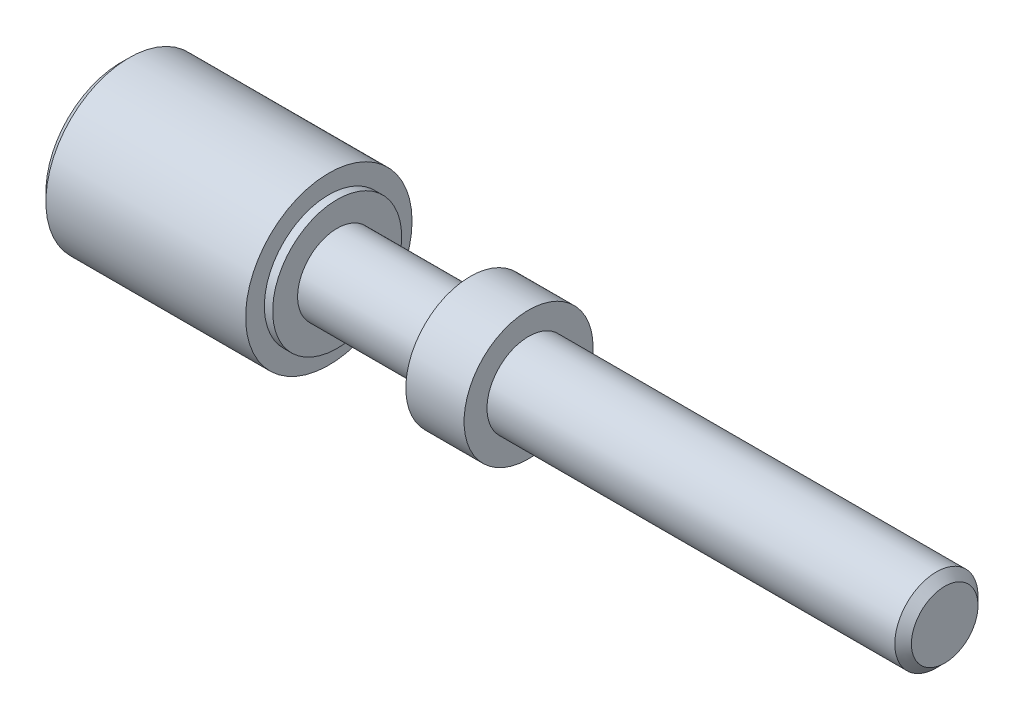
ISO-10303-21;
HEADER;
FILE_DESCRIPTION(('STEP AP214'),'2;1');
FILE_NAME('part.step','',(''),(''),'','','');
FILE_SCHEMA(('AUTOMOTIVE_DESIGN { 1 0 10303 214 1 1 1 1 }'));
ENDSEC;
DATA;
#1=APPLICATION_CONTEXT('core data for automotive mechanical design processes');
#2=APPLICATION_PROTOCOL_DEFINITION('international standard','automotive_design',2000,#1);
#3=PRODUCT_CONTEXT('',#1,'mechanical');
#4=PRODUCT('Part','Part','',(#3));
#5=PRODUCT_RELATED_PRODUCT_CATEGORY('part','',(#4));
#6=PRODUCT_DEFINITION_FORMATION('','',#4);
#7=PRODUCT_DEFINITION_CONTEXT('part definition',#1,'design');
#8=PRODUCT_DEFINITION('design','',#6,#7);
#9=PRODUCT_DEFINITION_SHAPE('','',#8);
#10=(LENGTH_UNIT() NAMED_UNIT(*) SI_UNIT(.MILLI.,.METRE.));
#11=(NAMED_UNIT(*) PLANE_ANGLE_UNIT() SI_UNIT($,.RADIAN.));
#12=(NAMED_UNIT(*) SI_UNIT($,.STERADIAN.) SOLID_ANGLE_UNIT());
#13=UNCERTAINTY_MEASURE_WITH_UNIT(LENGTH_MEASURE(1.E-05),#10,'distance_accuracy_value','');
#14=(GEOMETRIC_REPRESENTATION_CONTEXT(3) GLOBAL_UNCERTAINTY_ASSIGNED_CONTEXT((#13)) GLOBAL_UNIT_ASSIGNED_CONTEXT((#10,
#11,#12)) REPRESENTATION_CONTEXT('',''));
#15=CARTESIAN_POINT('',(0.,0.,0.));
#16=DIRECTION('',(0.,0.,1.));
#17=DIRECTION('',(1.,0.,0.));
#18=AXIS2_PLACEMENT_3D('',#15,#16,#17);
#19=CARTESIAN_POINT('',(-13.0000000000337,0.,0.));
#20=DIRECTION('',(-1.,0.,0.));
#21=DIRECTION('',(0.,0.,1.));
#22=AXIS2_PLACEMENT_3D('',#19,#20,#21);
#23=CONICAL_SURFACE('',#22,5.0000000000523,1.04719755120017);
#24=CARTESIAN_POINT('',(-13.0000000000337,0.,0.));
#25=DIRECTION('',(-1.,0.,0.));
#26=DIRECTION('',(0.,0.,1.));
#27=AXIS2_PLACEMENT_3D('',#24,#25,#26);
#28=CIRCLE('',#27,5.0000000000523);
#29=CARTESIAN_POINT('',(-13.0000000000168,4.33012701894484,2.50000000001307));
#30=VERTEX_POINT('',#29);
#31=CARTESIAN_POINT('',(-13.0000000000168,4.33012701894484,-2.50000000001308));
#32=VERTEX_POINT('',#31);
#33=EDGE_CURVE('E107',#30,#32,#28,.T.);
#34=ORIENTED_EDGE('',*,*,#33,.T.);
#35=CARTESIAN_POINT('',(-13.0000000000337,0.,0.));
#36=DIRECTION('',(-1.,0.,0.));
#37=DIRECTION('',(0.,0.,1.));
#38=AXIS2_PLACEMENT_3D('',#35,#36,#37);
#39=CIRCLE('',#38,5.0000000000523);
#40=CARTESIAN_POINT('',(-13.0000000000168,0.,-5.00000000002615));
#41=VERTEX_POINT('',#40);
#42=EDGE_CURVE('E115',#32,#41,#39,.T.);
#43=ORIENTED_EDGE('',*,*,#42,.T.);
#44=CARTESIAN_POINT('',(-13.0000000000337,0.,0.));
#45=DIRECTION('',(-1.,0.,0.));
#46=DIRECTION('',(0.,0.,1.));
#47=AXIS2_PLACEMENT_3D('',#44,#45,#46);
#48=CIRCLE('',#47,5.0000000000523);
#49=CARTESIAN_POINT('',(-13.0000000000168,-4.33012701894484,-2.50000000001308));
#50=VERTEX_POINT('',#49);
#51=EDGE_CURVE('E217',#41,#50,#48,.T.);
#52=ORIENTED_EDGE('',*,*,#51,.T.);
#53=CARTESIAN_POINT('',(-13.0000000000337,0.,0.));
#54=DIRECTION('',(-1.,0.,0.));
#55=DIRECTION('',(0.,0.,1.));
#56=AXIS2_PLACEMENT_3D('',#53,#54,#55);
#57=CIRCLE('',#56,5.0000000000523);
#58=CARTESIAN_POINT('',(-13.0000000000168,-4.33012701894484,2.50000000001308));
#59=VERTEX_POINT('',#58);
#60=EDGE_CURVE('E89',#50,#59,#57,.T.);
#61=ORIENTED_EDGE('',*,*,#60,.T.);
#62=CARTESIAN_POINT('',(-13.0000000000337,0.,0.));
#63=DIRECTION('',(-1.,0.,0.));
#64=DIRECTION('',(0.,0.,1.));
#65=AXIS2_PLACEMENT_3D('',#62,#63,#64);
#66=CIRCLE('',#65,5.0000000000523);
#67=CARTESIAN_POINT('',(-13.0000000000168,0.,5.00000000002615));
#68=VERTEX_POINT('',#67);
#69=EDGE_CURVE('E20',#59,#68,#66,.T.);
#70=ORIENTED_EDGE('',*,*,#69,.T.);
#71=CARTESIAN_POINT('',(-13.0000000000337,0.,0.));
#72=DIRECTION('',(-1.,0.,0.));
#73=DIRECTION('',(0.,0.,1.));
#74=AXIS2_PLACEMENT_3D('',#71,#72,#73);
#75=CIRCLE('',#74,5.0000000000523);
#76=EDGE_CURVE('E95',#68,#30,#75,.T.);
#77=ORIENTED_EDGE('',*,*,#76,.T.);
#78=EDGE_LOOP('',(#34,#43,#52,#61,#70,#77));
#79=FACE_BOUND('',#78,.T.);
#80=CARTESIAN_POINT('',(-10.1132486540507,2.8421709430404E-11,0.));
#81=VERTEX_POINT('',#80);
#82=VERTEX_LOOP('',#81);
#83=FACE_BOUND('',#82,.T.);
#84=ADVANCED_FACE('F17',(#79,#83),#23,.F.);
#85=CARTESIAN_POINT('',(-13.,0.,0.));
#86=DIRECTION('',(1.,0.,0.));
#87=DIRECTION('',(0.,0.,-1.));
#88=AXIS2_PLACEMENT_3D('',#85,#86,#87);
#89=PLANE('',#88);
#90=DIRECTION('',(0.,-0.5,-0.866025403784439));
#91=VECTOR('',#90,1.);
#92=CARTESIAN_POINT('',(-13.,-5.77350269189626,0.));
#93=LINE('',#92,#91);
#94=CARTESIAN_POINT('',(-13.,-2.88675134594813,5.));
#95=VERTEX_POINT('',#94);
#96=EDGE_CURVE('E102',#59,#95,#93,.F.);
#97=ORIENTED_EDGE('',*,*,#96,.T.);
#98=DIRECTION('',(0.,1.,0.));
#99=VECTOR('',#98,1.);
#100=CARTESIAN_POINT('',(-13.,-2.88675134594813,5.));
#101=LINE('',#100,#99);
#102=EDGE_CURVE('E100',#95,#68,#101,.T.);
#103=ORIENTED_EDGE('',*,*,#102,.T.);
#104=ORIENTED_EDGE('',*,*,#69,.F.);
#105=EDGE_LOOP('',(#97,#103,#104));
#106=FACE_BOUND('',#105,.T.);
#107=ADVANCED_FACE('F101',(#106),#89,.F.);
#108=CARTESIAN_POINT('',(-13.,0.,0.));
#109=DIRECTION('',(1.,0.,0.));
#110=DIRECTION('',(0.,0.,-1.));
#111=AXIS2_PLACEMENT_3D('',#108,#109,#110);
#112=PLANE('',#111);
#113=DIRECTION('',(0.,0.5,-0.866025403784439));
#114=VECTOR('',#113,1.);
#115=CARTESIAN_POINT('',(-13.,-2.88675134594813,-5.));
#116=LINE('',#115,#114);
#117=CARTESIAN_POINT('',(-13.,-5.77350269189626,0.));
#118=VERTEX_POINT('',#117);
#119=EDGE_CURVE('E165',#50,#118,#116,.F.);
#120=ORIENTED_EDGE('',*,*,#119,.T.);
#121=DIRECTION('',(0.,-0.5,-0.866025403784439));
#122=VECTOR('',#121,1.);
#123=CARTESIAN_POINT('',(-13.,-5.77350269189626,0.));
#124=LINE('',#123,#122);
#125=EDGE_CURVE('E120',#118,#59,#124,.F.);
#126=ORIENTED_EDGE('',*,*,#125,.T.);
#127=ORIENTED_EDGE('',*,*,#60,.F.);
#128=EDGE_LOOP('',(#120,#126,#127));
#129=FACE_BOUND('',#128,.T.);
#130=ADVANCED_FACE('F228',(#129),#112,.F.);
#131=CARTESIAN_POINT('',(-13.,0.,0.));
#132=DIRECTION('',(1.,0.,0.));
#133=DIRECTION('',(0.,0.,-1.));
#134=AXIS2_PLACEMENT_3D('',#131,#132,#133);
#135=PLANE('',#134);
#136=DIRECTION('',(0.,1.,0.));
#137=VECTOR('',#136,1.);
#138=CARTESIAN_POINT('',(-13.,2.88675134594813,-5.));
#139=LINE('',#138,#137);
#140=CARTESIAN_POINT('',(-13.,-2.88675134594813,-5.));
#141=VERTEX_POINT('',#140);
#142=EDGE_CURVE('E151',#41,#141,#139,.F.);
#143=ORIENTED_EDGE('',*,*,#142,.T.);
#144=DIRECTION('',(0.,0.5,-0.866025403784439));
#145=VECTOR('',#144,1.);
#146=CARTESIAN_POINT('',(-13.,-2.88675134594813,-5.));
#147=LINE('',#146,#145);
#148=EDGE_CURVE('E162',#141,#50,#147,.F.);
#149=ORIENTED_EDGE('',*,*,#148,.T.);
#150=ORIENTED_EDGE('',*,*,#51,.F.);
#151=EDGE_LOOP('',(#143,#149,#150));
#152=FACE_BOUND('',#151,.T.);
#153=ADVANCED_FACE('F223',(#152),#135,.F.);
#154=CARTESIAN_POINT('',(-13.,0.,0.));
#155=DIRECTION('',(1.,0.,0.));
#156=DIRECTION('',(0.,0.,-1.));
#157=AXIS2_PLACEMENT_3D('',#154,#155,#156);
#158=PLANE('',#157);
#159=DIRECTION('',(0.,0.5,0.866025403784439));
#160=VECTOR('',#159,1.);
#161=CARTESIAN_POINT('',(-13.,5.77350269189626,0.));
#162=LINE('',#161,#160);
#163=CARTESIAN_POINT('',(-13.,2.88675134594813,-5.));
#164=VERTEX_POINT('',#163);
#165=EDGE_CURVE('E142',#32,#164,#162,.F.);
#166=ORIENTED_EDGE('',*,*,#165,.T.);
#167=DIRECTION('',(0.,1.,0.));
#168=VECTOR('',#167,1.);
#169=CARTESIAN_POINT('',(-13.,2.88675134594813,-5.));
#170=LINE('',#169,#168);
#171=EDGE_CURVE('E148',#164,#41,#170,.F.);
#172=ORIENTED_EDGE('',*,*,#171,.T.);
#173=ORIENTED_EDGE('',*,*,#42,.F.);
#174=EDGE_LOOP('',(#166,#172,#173));
#175=FACE_BOUND('',#174,.T.);
#176=ADVANCED_FACE('F273',(#175),#158,.F.);
#177=CARTESIAN_POINT('',(-13.,0.,0.));
#178=DIRECTION('',(1.,0.,0.));
#179=DIRECTION('',(0.,0.,-1.));
#180=AXIS2_PLACEMENT_3D('',#177,#178,#179);
#181=PLANE('',#180);
#182=DIRECTION('',(0.,1.,0.));
#183=VECTOR('',#182,1.);
#184=CARTESIAN_POINT('',(-13.,-2.88675134594813,5.));
#185=LINE('',#184,#183);
#186=CARTESIAN_POINT('',(-13.,2.88675134594813,5.));
#187=VERTEX_POINT('',#186);
#188=EDGE_CURVE('E106',#68,#187,#185,.T.);
#189=ORIENTED_EDGE('',*,*,#188,.T.);
#190=DIRECTION('',(0.,-0.5,0.866025403784439));
#191=VECTOR('',#190,1.);
#192=CARTESIAN_POINT('',(-13.,2.88675134594813,5.));
#193=LINE('',#192,#191);
#194=EDGE_CURVE('E113',#187,#30,#193,.F.);
#195=ORIENTED_EDGE('',*,*,#194,.T.);
#196=ORIENTED_EDGE('',*,*,#76,.F.);
#197=EDGE_LOOP('',(#189,#195,#196));
#198=FACE_BOUND('',#197,.T.);
#199=ADVANCED_FACE('F110',(#198),#181,.F.);
#200=CARTESIAN_POINT('',(-13.,0.,0.));
#201=DIRECTION('',(1.,0.,0.));
#202=DIRECTION('',(0.,0.,-1.));
#203=AXIS2_PLACEMENT_3D('',#200,#201,#202);
#204=PLANE('',#203);
#205=DIRECTION('',(0.,-0.5,0.866025403784439));
#206=VECTOR('',#205,1.);
#207=CARTESIAN_POINT('',(-13.,2.88675134594813,5.));
#208=LINE('',#207,#206);
#209=CARTESIAN_POINT('',(-13.,5.77350269189626,0.));
#210=VERTEX_POINT('',#209);
#211=EDGE_CURVE('E257',#30,#210,#208,.F.);
#212=ORIENTED_EDGE('',*,*,#211,.T.);
#213=DIRECTION('',(0.,0.5,0.866025403784439));
#214=VECTOR('',#213,1.);
#215=CARTESIAN_POINT('',(-13.,5.77350269189626,0.));
#216=LINE('',#215,#214);
#217=EDGE_CURVE('E145',#210,#32,#216,.F.);
#218=ORIENTED_EDGE('',*,*,#217,.T.);
#219=ORIENTED_EDGE('',*,*,#33,.F.);
#220=EDGE_LOOP('',(#212,#218,#219));
#221=FACE_BOUND('',#220,.T.);
#222=ADVANCED_FACE('F270',(#221),#204,.F.);
#223=CARTESIAN_POINT('',(-25.,-2.88675134594813,5.));
#224=DIRECTION('',(0.,0.,1.));
#225=DIRECTION('',(1.,0.,0.));
#226=AXIS2_PLACEMENT_3D('',#223,#224,#225);
#227=PLANE('',#226);
#228=DIRECTION('',(1.,0.,0.));
#229=VECTOR('',#228,1.);
#230=CARTESIAN_POINT('',(-25.,2.88675134594813,5.));
#231=LINE('',#230,#229);
#232=CARTESIAN_POINT('',(-25.,2.88675134594813,5.));
#233=VERTEX_POINT('',#232);
#234=EDGE_CURVE('E119',#233,#187,#231,.T.);
#235=ORIENTED_EDGE('',*,*,#234,.T.);
#236=ORIENTED_EDGE('',*,*,#188,.F.);
#237=ORIENTED_EDGE('',*,*,#102,.F.);
#238=DIRECTION('',(1.,0.,0.));
#239=VECTOR('',#238,1.);
#240=CARTESIAN_POINT('',(-25.,-2.88675134594813,5.));
#241=LINE('',#240,#239);
#242=CARTESIAN_POINT('',(-25.,-2.88675134594813,5.));
#243=VERTEX_POINT('',#242);
#244=EDGE_CURVE('E166',#95,#243,#241,.F.);
#245=ORIENTED_EDGE('',*,*,#244,.T.);
#246=DIRECTION('',(0.,1.,0.));
#247=VECTOR('',#246,1.);
#248=CARTESIAN_POINT('',(-25.,4.5,5.));
#249=LINE('',#248,#247);
#250=EDGE_CURVE('E129',#233,#243,#249,.F.);
#251=ORIENTED_EDGE('',*,*,#250,.F.);
#252=EDGE_LOOP('',(#235,#236,#237,#245,#251));
#253=FACE_BOUND('',#252,.T.);
#254=ADVANCED_FACE('F117',(#253),#227,.F.);
#255=CARTESIAN_POINT('',(-25.,-5.77350269189626,0.));
#256=DIRECTION('',(0.,-0.866025403784439,0.5));
#257=DIRECTION('',(0.,-0.5,-0.866025403784439));
#258=AXIS2_PLACEMENT_3D('',#255,#256,#257);
#259=PLANE('',#258);
#260=ORIENTED_EDGE('',*,*,#244,.F.);
#261=ORIENTED_EDGE('',*,*,#96,.F.);
#262=ORIENTED_EDGE('',*,*,#125,.F.);
#263=DIRECTION('',(1.,0.,0.));
#264=VECTOR('',#263,1.);
#265=CARTESIAN_POINT('',(-25.,-5.77350269189626,0.));
#266=LINE('',#265,#264);
#267=CARTESIAN_POINT('',(-25.,-5.77350269189626,0.));
#268=VERTEX_POINT('',#267);
#269=EDGE_CURVE('E152',#118,#268,#266,.F.);
#270=ORIENTED_EDGE('',*,*,#269,.T.);
#271=DIRECTION('',(0.,-0.5,-0.866025403784439));
#272=VECTOR('',#271,1.);
#273=CARTESIAN_POINT('',(-25.,-2.88675134594813,5.));
#274=LINE('',#273,#272);
#275=EDGE_CURVE('E132',#243,#268,#274,.T.);
#276=ORIENTED_EDGE('',*,*,#275,.F.);
#277=EDGE_LOOP('',(#260,#261,#262,#270,#276));
#278=FACE_BOUND('',#277,.T.);
#279=ADVANCED_FACE('F238',(#278),#259,.F.);
#280=CARTESIAN_POINT('',(-25.,-2.88675134594813,-5.));
#281=DIRECTION('',(0.,-0.866025403784439,-0.5));
#282=DIRECTION('',(0.,0.5,-0.866025403784439));
#283=AXIS2_PLACEMENT_3D('',#280,#281,#282);
#284=PLANE('',#283);
#285=ORIENTED_EDGE('',*,*,#269,.F.);
#286=ORIENTED_EDGE('',*,*,#119,.F.);
#287=ORIENTED_EDGE('',*,*,#148,.F.);
#288=DIRECTION('',(-1.,0.,0.));
#289=VECTOR('',#288,1.);
#290=CARTESIAN_POINT('',(-25.,-2.88675134594813,-5.));
#291=LINE('',#290,#289);
#292=CARTESIAN_POINT('',(-25.,-2.88675134594813,-5.));
#293=VERTEX_POINT('',#292);
#294=EDGE_CURVE('E159',#141,#293,#291,.T.);
#295=ORIENTED_EDGE('',*,*,#294,.T.);
#296=DIRECTION('',(0.,0.5,-0.866025403784439));
#297=VECTOR('',#296,1.);
#298=CARTESIAN_POINT('',(-25.,-5.77350269189626,0.));
#299=LINE('',#298,#297);
#300=EDGE_CURVE('E234',#268,#293,#299,.T.);
#301=ORIENTED_EDGE('',*,*,#300,.F.);
#302=EDGE_LOOP('',(#285,#286,#287,#295,#301));
#303=FACE_BOUND('',#302,.T.);
#304=ADVANCED_FACE('F231',(#303),#284,.F.);
#305=CARTESIAN_POINT('',(-25.,2.88675134594813,-5.));
#306=DIRECTION('',(0.,0.,-1.));
#307=DIRECTION('',(-1.,0.,0.));
#308=AXIS2_PLACEMENT_3D('',#305,#306,#307);
#309=PLANE('',#308);
#310=ORIENTED_EDGE('',*,*,#294,.F.);
#311=ORIENTED_EDGE('',*,*,#142,.F.);
#312=ORIENTED_EDGE('',*,*,#171,.F.);
#313=DIRECTION('',(1.,0.,0.));
#314=VECTOR('',#313,1.);
#315=CARTESIAN_POINT('',(-25.,2.88675134594813,-5.));
#316=LINE('',#315,#314);
#317=CARTESIAN_POINT('',(-25.,2.88675134594813,-5.));
#318=VERTEX_POINT('',#317);
#319=EDGE_CURVE('E144',#164,#318,#316,.F.);
#320=ORIENTED_EDGE('',*,*,#319,.T.);
#321=DIRECTION('',(0.,1.,0.));
#322=VECTOR('',#321,1.);
#323=CARTESIAN_POINT('',(-25.,4.5,-5.));
#324=LINE('',#323,#322);
#325=EDGE_CURVE('E247',#293,#318,#324,.T.);
#326=ORIENTED_EDGE('',*,*,#325,.F.);
#327=EDGE_LOOP('',(#310,#311,#312,#320,#326));
#328=FACE_BOUND('',#327,.T.);
#329=ADVANCED_FACE('F277',(#328),#309,.F.);
#330=CARTESIAN_POINT('',(-25.,5.77350269189626,0.));
#331=DIRECTION('',(0.,0.866025403784439,-0.5));
#332=DIRECTION('',(0.,0.5,0.866025403784439));
#333=AXIS2_PLACEMENT_3D('',#330,#331,#332);
#334=PLANE('',#333);
#335=ORIENTED_EDGE('',*,*,#319,.F.);
#336=ORIENTED_EDGE('',*,*,#165,.F.);
#337=ORIENTED_EDGE('',*,*,#217,.F.);
#338=DIRECTION('',(1.,0.,0.));
#339=VECTOR('',#338,1.);
#340=CARTESIAN_POINT('',(-25.,5.77350269189626,0.));
#341=LINE('',#340,#339);
#342=CARTESIAN_POINT('',(-25.,5.77350269189626,0.));
#343=VERTEX_POINT('',#342);
#344=EDGE_CURVE('E35',#210,#343,#341,.F.);
#345=ORIENTED_EDGE('',*,*,#344,.T.);
#346=DIRECTION('',(0.,0.5,0.866025403784439));
#347=VECTOR('',#346,1.);
#348=CARTESIAN_POINT('',(-25.,2.88675134594813,-5.));
#349=LINE('',#348,#347);
#350=EDGE_CURVE('E139',#318,#343,#349,.T.);
#351=ORIENTED_EDGE('',*,*,#350,.F.);
#352=EDGE_LOOP('',(#335,#336,#337,#345,#351));
#353=FACE_BOUND('',#352,.T.);
#354=ADVANCED_FACE('F275',(#353),#334,.F.);
#355=CARTESIAN_POINT('',(-25.,2.88675134594813,5.));
#356=DIRECTION('',(0.,0.866025403784439,0.5));
#357=DIRECTION('',(0.,-0.5,0.866025403784439));
#358=AXIS2_PLACEMENT_3D('',#355,#356,#357);
#359=PLANE('',#358);
#360=ORIENTED_EDGE('',*,*,#344,.F.);
#361=ORIENTED_EDGE('',*,*,#211,.F.);
#362=ORIENTED_EDGE('',*,*,#194,.F.);
#363=ORIENTED_EDGE('',*,*,#234,.F.);
#364=DIRECTION('',(0.,-0.5,0.866025403784439));
#365=VECTOR('',#364,1.);
#366=CARTESIAN_POINT('',(-25.,5.77350269189626,0.));
#367=LINE('',#366,#365);
#368=EDGE_CURVE('E135',#343,#233,#367,.T.);
#369=ORIENTED_EDGE('',*,*,#368,.F.);
#370=EDGE_LOOP('',(#360,#361,#362,#363,#369));
#371=FACE_BOUND('',#370,.T.);
#372=ADVANCED_FACE('F241',(#371),#359,.F.);
#373=CARTESIAN_POINT('',(-25.,4.5,0.));
#374=DIRECTION('',(-1.,0.,0.));
#375=DIRECTION('',(0.,0.,1.));
#376=AXIS2_PLACEMENT_3D('',#373,#374,#375);
#377=PLANE('',#376);
#378=CARTESIAN_POINT('',(-25.,0.,0.));
#379=DIRECTION('',(1.,0.,0.));
#380=DIRECTION('',(0.,0.,-1.));
#381=AXIS2_PLACEMENT_3D('',#378,#379,#380);
#382=CIRCLE('',#381,9.);
#383=CARTESIAN_POINT('',(-25.,0.,-9.));
#384=VERTEX_POINT('',#383);
#385=EDGE_CURVE('E138',#384,#384,#382,.T.);
#386=ORIENTED_EDGE('',*,*,#385,.F.);
#387=EDGE_LOOP('',(#386));
#388=FACE_BOUND('',#387,.T.);
#389=ORIENTED_EDGE('',*,*,#350,.T.);
#390=ORIENTED_EDGE('',*,*,#368,.T.);
#391=ORIENTED_EDGE('',*,*,#250,.T.);
#392=ORIENTED_EDGE('',*,*,#275,.T.);
#393=ORIENTED_EDGE('',*,*,#300,.T.);
#394=ORIENTED_EDGE('',*,*,#325,.T.);
#395=EDGE_LOOP('',(#389,#390,#391,#392,#393,#394));
#396=FACE_BOUND('',#395,.T.);
#397=ADVANCED_FACE('F244',(#388,#396),#377,.T.);
#398=CARTESIAN_POINT('',(-24.,0.,0.));
#399=DIRECTION('',(1.,0.,0.));
#400=DIRECTION('',(0.,0.,-1.));
#401=AXIS2_PLACEMENT_3D('',#398,#399,#400);
#402=CONICAL_SURFACE('',#401,10.,0.785398163397448);
#403=ORIENTED_EDGE('',*,*,#385,.T.);
#404=EDGE_LOOP('',(#403));
#405=FACE_BOUND('',#404,.T.);
#406=CARTESIAN_POINT('',(-24.,0.,0.));
#407=DIRECTION('',(1.,0.,0.));
#408=DIRECTION('',(0.,0.,-1.));
#409=AXIS2_PLACEMENT_3D('',#406,#407,#408);
#410=CIRCLE('',#409,10.);
#411=CARTESIAN_POINT('',(-24.,0.,-10.));
#412=VERTEX_POINT('',#411);
#413=EDGE_CURVE('E212',#412,#412,#410,.T.);
#414=ORIENTED_EDGE('',*,*,#413,.F.);
#415=EDGE_LOOP('',(#414));
#416=FACE_BOUND('',#415,.T.);
#417=ADVANCED_FACE('F335',(#405,#416),#402,.T.);
#418=CARTESIAN_POINT('',(-12.,0.,0.));
#419=DIRECTION('',(1.,0.,0.));
#420=DIRECTION('',(0.,0.,-1.));
#421=AXIS2_PLACEMENT_3D('',#418,#419,#420);
#422=CYLINDRICAL_SURFACE('',#421,10.);
#423=ORIENTED_EDGE('',*,*,#413,.T.);
#424=EDGE_LOOP('',(#423));
#425=FACE_BOUND('',#424,.T.);
#426=CARTESIAN_POINT('',(0.,0.,0.));
#427=DIRECTION('',(1.,0.,0.));
#428=DIRECTION('',(0.,0.,-1.));
#429=AXIS2_PLACEMENT_3D('',#426,#427,#428);
#430=CIRCLE('',#429,10.);
#431=CARTESIAN_POINT('',(0.,0.,-10.));
#432=VERTEX_POINT('',#431);
#433=EDGE_CURVE('E209',#432,#432,#430,.T.);
#434=ORIENTED_EDGE('',*,*,#433,.F.);
#435=EDGE_LOOP('',(#434));
#436=FACE_BOUND('',#435,.T.);
#437=ADVANCED_FACE('F331',(#425,#436),#422,.T.);
#438=CARTESIAN_POINT('',(0.,8.875,0.));
#439=DIRECTION('',(1.,0.,0.));
#440=DIRECTION('',(0.,0.,-1.));
#441=AXIS2_PLACEMENT_3D('',#438,#439,#440);
#442=PLANE('',#441);
#443=CARTESIAN_POINT('',(0.,0.,0.));
#444=DIRECTION('',(1.,0.,0.));
#445=DIRECTION('',(0.,0.,-1.));
#446=AXIS2_PLACEMENT_3D('',#443,#444,#445);
#447=CIRCLE('',#446,7.75);
#448=CARTESIAN_POINT('',(0.,0.,-7.75));
#449=VERTEX_POINT('',#448);
#450=EDGE_CURVE('E206',#449,#449,#447,.T.);
#451=ORIENTED_EDGE('',*,*,#450,.F.);
#452=EDGE_LOOP('',(#451));
#453=FACE_BOUND('',#452,.T.);
#454=ORIENTED_EDGE('',*,*,#433,.T.);
#455=EDGE_LOOP('',(#454));
#456=FACE_BOUND('',#455,.T.);
#457=ADVANCED_FACE('F327',(#453,#456),#442,.T.);
#458=CARTESIAN_POINT('',(0.5,0.,0.));
#459=DIRECTION('',(1.,0.,0.));
#460=DIRECTION('',(0.,0.,-1.));
#461=AXIS2_PLACEMENT_3D('',#458,#459,#460);
#462=CYLINDRICAL_SURFACE('',#461,7.75);
#463=ORIENTED_EDGE('',*,*,#450,.T.);
#464=EDGE_LOOP('',(#463));
#465=FACE_BOUND('',#464,.T.);
#466=CARTESIAN_POINT('',(1.,0.,0.));
#467=DIRECTION('',(1.,0.,0.));
#468=DIRECTION('',(0.,0.,-1.));
#469=AXIS2_PLACEMENT_3D('',#466,#467,#468);
#470=CIRCLE('',#469,7.75);
#471=CARTESIAN_POINT('',(1.,0.,-7.75));
#472=VERTEX_POINT('',#471);
#473=EDGE_CURVE('E203',#472,#472,#470,.T.);
#474=ORIENTED_EDGE('',*,*,#473,.F.);
#475=EDGE_LOOP('',(#474));
#476=FACE_BOUND('',#475,.T.);
#477=ADVANCED_FACE('F323',(#465,#476),#462,.T.);
#478=CARTESIAN_POINT('',(1.,6.25,0.));
#479=DIRECTION('',(1.,0.,0.));
#480=DIRECTION('',(0.,0.,-1.));
#481=AXIS2_PLACEMENT_3D('',#478,#479,#480);
#482=PLANE('',#481);
#483=CARTESIAN_POINT('',(1.,0.,0.));
#484=DIRECTION('',(1.,0.,0.));
#485=DIRECTION('',(0.,0.,-1.));
#486=AXIS2_PLACEMENT_3D('',#483,#484,#485);
#487=CIRCLE('',#486,4.75);
#488=CARTESIAN_POINT('',(1.,0.,-4.75));
#489=VERTEX_POINT('',#488);
#490=EDGE_CURVE('E200',#489,#489,#487,.T.);
#491=ORIENTED_EDGE('',*,*,#490,.F.);
#492=EDGE_LOOP('',(#491));
#493=FACE_BOUND('',#492,.T.);
#494=ORIENTED_EDGE('',*,*,#473,.T.);
#495=EDGE_LOOP('',(#494));
#496=FACE_BOUND('',#495,.T.);
#497=ADVANCED_FACE('F319',(#493,#496),#482,.T.);
#498=CARTESIAN_POINT('',(9.,0.,0.));
#499=DIRECTION('',(1.,0.,0.));
#500=DIRECTION('',(0.,0.,-1.));
#501=AXIS2_PLACEMENT_3D('',#498,#499,#500);
#502=CYLINDRICAL_SURFACE('',#501,4.75);
#503=ORIENTED_EDGE('',*,*,#490,.T.);
#504=EDGE_LOOP('',(#503));
#505=FACE_BOUND('',#504,.T.);
#506=CARTESIAN_POINT('',(17.,0.,0.));
#507=DIRECTION('',(1.,0.,0.));
#508=DIRECTION('',(0.,0.,-1.));
#509=AXIS2_PLACEMENT_3D('',#506,#507,#508);
#510=CIRCLE('',#509,4.75);
#511=CARTESIAN_POINT('',(17.,0.,-4.75));
#512=VERTEX_POINT('',#511);
#513=EDGE_CURVE('E197',#512,#512,#510,.T.);
#514=ORIENTED_EDGE('',*,*,#513,.F.);
#515=EDGE_LOOP('',(#514));
#516=FACE_BOUND('',#515,.T.);
#517=ADVANCED_FACE('F315',(#505,#516),#502,.T.);
#518=CARTESIAN_POINT('',(17.,6.25,0.));
#519=DIRECTION('',(-1.,0.,0.));
#520=DIRECTION('',(0.,0.,1.));
#521=AXIS2_PLACEMENT_3D('',#518,#519,#520);
#522=PLANE('',#521);
#523=CARTESIAN_POINT('',(17.,0.,0.));
#524=DIRECTION('',(1.,0.,0.));
#525=DIRECTION('',(0.,0.,-1.));
#526=AXIS2_PLACEMENT_3D('',#523,#524,#525);
#527=CIRCLE('',#526,7.75);
#528=CARTESIAN_POINT('',(17.,0.,-7.75));
#529=VERTEX_POINT('',#528);
#530=EDGE_CURVE('E194',#529,#529,#527,.T.);
#531=ORIENTED_EDGE('',*,*,#530,.F.);
#532=EDGE_LOOP('',(#531));
#533=FACE_BOUND('',#532,.T.);
#534=ORIENTED_EDGE('',*,*,#513,.T.);
#535=EDGE_LOOP('',(#534));
#536=FACE_BOUND('',#535,.T.);
#537=ADVANCED_FACE('F311',(#533,#536),#522,.T.);
#538=CARTESIAN_POINT('',(74.,2.,0.));
#539=DIRECTION('',(1.,0.,0.));
#540=DIRECTION('',(0.,0.,-1.));
#541=AXIS2_PLACEMENT_3D('',#538,#539,#540);
#542=PLANE('',#541);
#543=CARTESIAN_POINT('',(74.0000000000691,0.,0.));
#544=DIRECTION('',(-1.,0.,0.));
#545=DIRECTION('',(0.,0.,1.));
#546=AXIS2_PLACEMENT_3D('',#543,#544,#545);
#547=CIRCLE('',#546,3.99999999996226);
#548=CARTESIAN_POINT('',(74.0000000000691,0.,3.99999999996226));
#549=VERTEX_POINT('',#548);
#550=EDGE_CURVE('E191',#549,#549,#547,.T.);
#551=ORIENTED_EDGE('',*,*,#550,.F.);
#552=EDGE_LOOP('',(#551));
#553=FACE_BOUND('',#552,.T.);
#554=ADVANCED_FACE('F307',(#553),#542,.T.);
#555=CARTESIAN_POINT('',(20.5,0.,0.));
#556=DIRECTION('',(1.,0.,0.));
#557=DIRECTION('',(0.,0.,-1.));
#558=AXIS2_PLACEMENT_3D('',#555,#556,#557);
#559=CYLINDRICAL_SURFACE('',#558,7.75);
#560=ORIENTED_EDGE('',*,*,#530,.T.);
#561=EDGE_LOOP('',(#560));
#562=FACE_BOUND('',#561,.T.);
#563=CARTESIAN_POINT('',(24.,0.,0.));
#564=DIRECTION('',(1.,0.,0.));
#565=DIRECTION('',(0.,0.,-1.));
#566=AXIS2_PLACEMENT_3D('',#563,#564,#565);
#567=CIRCLE('',#566,7.75);
#568=CARTESIAN_POINT('',(24.,0.,-7.75));
#569=VERTEX_POINT('',#568);
#570=EDGE_CURVE('E188',#569,#569,#567,.T.);
#571=ORIENTED_EDGE('',*,*,#570,.F.);
#572=EDGE_LOOP('',(#571));
#573=FACE_BOUND('',#572,.T.);
#574=ADVANCED_FACE('F303',(#562,#573),#559,.T.);
#575=CARTESIAN_POINT('',(72.9999999999791,0.,0.));
#576=DIRECTION('',(-1.,0.,0.));
#577=DIRECTION('',(0.,0.,1.));
#578=AXIS2_PLACEMENT_3D('',#575,#576,#577);
#579=CONICAL_SURFACE('',#578,5.0000000000523,0.785398163397448);
#580=ORIENTED_EDGE('',*,*,#550,.T.);
#581=EDGE_LOOP('',(#580));
#582=FACE_BOUND('',#581,.T.);
#583=CARTESIAN_POINT('',(73.,0.,0.));
#584=DIRECTION('',(1.,0.,0.));
#585=DIRECTION('',(0.,0.,-1.));
#586=AXIS2_PLACEMENT_3D('',#583,#584,#585);
#587=CIRCLE('',#586,5.);
#588=CARTESIAN_POINT('',(73.,0.,-5.));
#589=VERTEX_POINT('',#588);
#590=EDGE_CURVE('E26',#589,#589,#587,.F.);
#591=ORIENTED_EDGE('',*,*,#590,.F.);
#592=EDGE_LOOP('',(#591));
#593=FACE_BOUND('',#592,.T.);
#594=ADVANCED_FACE('F295',(#582,#593),#579,.T.);
#595=CARTESIAN_POINT('',(24.,6.375,0.));
#596=DIRECTION('',(1.,0.,0.));
#597=DIRECTION('',(0.,0.,-1.));
#598=AXIS2_PLACEMENT_3D('',#595,#596,#597);
#599=PLANE('',#598);
#600=CARTESIAN_POINT('',(24.,0.,0.));
#601=DIRECTION('',(1.,0.,0.));
#602=DIRECTION('',(0.,0.,-1.));
#603=AXIS2_PLACEMENT_3D('',#600,#601,#602);
#604=CIRCLE('',#603,5.);
#605=CARTESIAN_POINT('',(24.,0.,-5.));
#606=VERTEX_POINT('',#605);
#607=EDGE_CURVE('E11',#606,#606,#604,.T.);
#608=ORIENTED_EDGE('',*,*,#607,.F.);
#609=EDGE_LOOP('',(#608));
#610=FACE_BOUND('',#609,.T.);
#611=ORIENTED_EDGE('',*,*,#570,.T.);
#612=EDGE_LOOP('',(#611));
#613=FACE_BOUND('',#612,.T.);
#614=ADVANCED_FACE('F289',(#610,#613),#599,.T.);
#615=CARTESIAN_POINT('',(48.5,0.,0.));
#616=DIRECTION('',(1.,0.,0.));
#617=DIRECTION('',(0.,0.,-1.));
#618=AXIS2_PLACEMENT_3D('',#615,#616,#617);
#619=CYLINDRICAL_SURFACE('',#618,5.);
#620=ORIENTED_EDGE('',*,*,#590,.T.);
#621=EDGE_LOOP('',(#620));
#622=FACE_BOUND('',#621,.T.);
#623=ORIENTED_EDGE('',*,*,#607,.T.);
#624=EDGE_LOOP('',(#623));
#625=FACE_BOUND('',#624,.T.);
#626=ADVANCED_FACE('F287',(#622,#625),#619,.T.);
#627=CLOSED_SHELL('',(#84,#107,#130,#153,#176,#199,#222,#254,#279,#304,#329,#354,#372,#397,#417,
#437,#457,#477,#497,#517,#537,#554,#574,#594,#614,#626));
#628=MANIFOLD_SOLID_BREP('B1',#627);
#629=ADVANCED_BREP_SHAPE_REPRESENTATION('',(#18,#628),#14);
#630=SHAPE_DEFINITION_REPRESENTATION(#9,#629);
ENDSEC;
END-ISO-10303-21;
